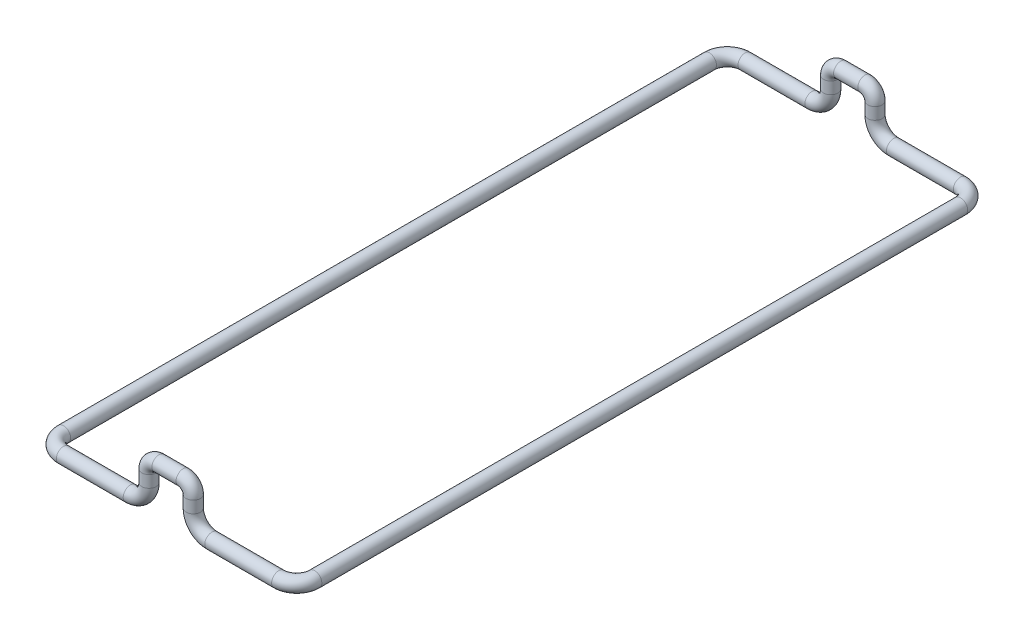
ISO-10303-21;
HEADER;
FILE_DESCRIPTION(('STEP AP214'),'2;1');
FILE_NAME('part.step','',(''),(''),'','','');
FILE_SCHEMA(('AUTOMOTIVE_DESIGN { 1 0 10303 214 1 1 1 1 }'));
ENDSEC;
DATA;
#1=APPLICATION_CONTEXT('core data for automotive mechanical design processes');
#2=APPLICATION_PROTOCOL_DEFINITION('international standard','automotive_design',2000,#1);
#3=PRODUCT_CONTEXT('',#1,'mechanical');
#4=PRODUCT('Part','Part','',(#3));
#5=PRODUCT_RELATED_PRODUCT_CATEGORY('part','',(#4));
#6=PRODUCT_DEFINITION_FORMATION('','',#4);
#7=PRODUCT_DEFINITION_CONTEXT('part definition',#1,'design');
#8=PRODUCT_DEFINITION('design','',#6,#7);
#9=PRODUCT_DEFINITION_SHAPE('','',#8);
#10=(LENGTH_UNIT() NAMED_UNIT(*) SI_UNIT(.MILLI.,.METRE.));
#11=(NAMED_UNIT(*) PLANE_ANGLE_UNIT() SI_UNIT($,.RADIAN.));
#12=(NAMED_UNIT(*) SI_UNIT($,.STERADIAN.) SOLID_ANGLE_UNIT());
#13=UNCERTAINTY_MEASURE_WITH_UNIT(LENGTH_MEASURE(1.E-05),#10,'distance_accuracy_value','');
#14=(GEOMETRIC_REPRESENTATION_CONTEXT(3) GLOBAL_UNCERTAINTY_ASSIGNED_CONTEXT((#13)) GLOBAL_UNIT_ASSIGNED_CONTEXT((#10,
#11,#12)) REPRESENTATION_CONTEXT('',''));
#15=CARTESIAN_POINT('',(0.,0.,0.));
#16=DIRECTION('',(0.,0.,1.));
#17=DIRECTION('',(1.,0.,0.));
#18=AXIS2_PLACEMENT_3D('',#15,#16,#17);
#19=CARTESIAN_POINT('',(7.66567035649461,-2.94835106418016,51.446892133563));
#20=DIRECTION('',(1.,0.,-4.26811217202508E-13));
#21=DIRECTION('',(-4.26811217202508E-13,0.,-1.));
#22=AXIS2_PLACEMENT_3D('',#19,#20,#21);
#23=CYLINDRICAL_SURFACE('',#22,0.999999999999998);
#24=CARTESIAN_POINT('',(16.9812320069101,-2.94835106418016,51.446892133559));
#25=DIRECTION('',(1.,0.,0.));
#26=DIRECTION('',(0.,0.,-1.));
#27=AXIS2_PLACEMENT_3D('',#24,#25,#26);
#28=CIRCLE('',#27,0.999999999999998);
#29=CARTESIAN_POINT('',(16.9812320069101,-2.94835106418016,52.4468921335559));
#30=VERTEX_POINT('',#29);
#31=EDGE_CURVE('E59',#30,#30,#28,.T.);
#32=ORIENTED_EDGE('',*,*,#31,.F.);
#33=EDGE_LOOP('',(#32));
#34=FACE_BOUND('',#33,.T.);
#35=CARTESIAN_POINT('',(7.66567035649461,-2.94835106418016,51.446892133563));
#36=DIRECTION('',(-1.,0.,0.));
#37=DIRECTION('',(0.,0.,1.));
#38=AXIS2_PLACEMENT_3D('',#35,#36,#37);
#39=CIRCLE('',#38,0.999999999999997);
#40=CARTESIAN_POINT('',(7.66567035649461,-3.94835106418016,51.446892133563));
#41=VERTEX_POINT('',#40);
#42=EDGE_CURVE('E83',#41,#41,#39,.T.);
#43=ORIENTED_EDGE('',*,*,#42,.F.);
#44=EDGE_LOOP('',(#43));
#45=FACE_BOUND('',#44,.T.);
#46=ADVANCED_FACE('F39',(#34,#45),#23,.T.);
#47=CARTESIAN_POINT('',(16.9812320069101,-2.94835106418016,48.946892133563));
#48=DIRECTION('',(0.,1.,0.));
#49=DIRECTION('',(0.,0.,1.));
#50=AXIS2_PLACEMENT_3D('',#47,#48,#49);
#51=TOROIDAL_SURFACE('',#50,2.49999999999286,0.999999999999998);
#52=CARTESIAN_POINT('',(19.4812320069061,-2.94835106418016,48.9468921335635));
#53=DIRECTION('',(4.27599753613536E-13,0.,-1.));
#54=DIRECTION('',(-1.,0.,-4.27599753613536E-13));
#55=AXIS2_PLACEMENT_3D('',#52,#53,#54);
#56=CIRCLE('',#55,0.999999999999998);
#57=CARTESIAN_POINT('',(20.4812320069029,-2.94835106418016,48.9468921335637));
#58=VERTEX_POINT('',#57);
#59=EDGE_CURVE('E54',#58,#58,#56,.T.);
#60=CARTESIAN_POINT('',(16.9812320069101,-2.94835106418016,48.946892133563));
#61=DIRECTION('',(0.,1.,0.));
#62=DIRECTION('',(0.,0.,1.));
#63=AXIS2_PLACEMENT_3D('',#60,#61,#62);
#64=CIRCLE('',#63,3.49999999999285);
#65=EDGE_CURVE('',#30,#58,#64,.T.);
#66=ORIENTED_EDGE('',*,*,#31,.T.);
#67=ORIENTED_EDGE('',*,*,#59,.F.);
#68=ORIENTED_EDGE('',*,*,#65,.T.);
#69=ORIENTED_EDGE('',*,*,#65,.F.);
#70=EDGE_LOOP('',(#66,#68,#67,#69));
#71=FACE_BOUND('',#70,.T.);
#72=ADVANCED_FACE('F166',(#71),#51,.T.);
#73=CARTESIAN_POINT('',(19.4812320069061,-2.94835106418016,48.9468921335635));
#74=DIRECTION('',(0.,0.,-1.));
#75=DIRECTION('',(-1.,0.,0.));
#76=AXIS2_PLACEMENT_3D('',#73,#74,#75);
#77=CYLINDRICAL_SURFACE('',#76,0.999999999999998);
#78=CARTESIAN_POINT('',(19.4812320069061,-2.94835106418016,-41.0531078664365));
#79=DIRECTION('',(4.27599753613536E-13,0.,-1.));
#80=DIRECTION('',(-1.,0.,-4.27599753613536E-13));
#81=AXIS2_PLACEMENT_3D('',#78,#79,#80);
#82=CIRCLE('',#81,0.999999999999998);
#83=CARTESIAN_POINT('',(20.4812320069061,-2.94835106418016,-41.0531078664363));
#84=VERTEX_POINT('',#83);
#85=EDGE_CURVE('E50',#84,#84,#82,.T.);
#86=ORIENTED_EDGE('',*,*,#85,.F.);
#87=EDGE_LOOP('',(#86));
#88=FACE_BOUND('',#87,.T.);
#89=ORIENTED_EDGE('',*,*,#59,.T.);
#90=EDGE_LOOP('',(#89));
#91=FACE_BOUND('',#90,.T.);
#92=ADVANCED_FACE('F161',(#88,#91),#77,.T.);
#93=CARTESIAN_POINT('',(16.9812320069101,-2.94835106418016,-41.053107866437));
#94=DIRECTION('',(0.,1.,0.));
#95=DIRECTION('',(0.,0.,1.));
#96=AXIS2_PLACEMENT_3D('',#93,#94,#95);
#97=TOROIDAL_SURFACE('',#96,2.49999999999602,0.999999999999998);
#98=CARTESIAN_POINT('',(16.9812320069106,-2.94835106418016,-43.553107866433));
#99=DIRECTION('',(-1.,0.,-4.30077930007789E-13));
#100=DIRECTION('',(-4.30077930007789E-13,0.,1.));
#101=AXIS2_PLACEMENT_3D('',#98,#99,#100);
#102=CIRCLE('',#101,0.999999999999998);
#103=CARTESIAN_POINT('',(16.9812320069107,-2.94835106418016,-44.553107866433));
#104=VERTEX_POINT('',#103);
#105=EDGE_CURVE('E46',#104,#104,#102,.T.);
#106=CARTESIAN_POINT('',(16.9812320069101,-2.94835106418016,-41.053107866437));
#107=DIRECTION('',(0.,1.,0.));
#108=DIRECTION('',(0.,0.,1.));
#109=AXIS2_PLACEMENT_3D('',#106,#107,#108);
#110=CIRCLE('',#109,3.49999999999602);
#111=EDGE_CURVE('',#84,#104,#110,.T.);
#112=ORIENTED_EDGE('',*,*,#85,.T.);
#113=ORIENTED_EDGE('',*,*,#105,.F.);
#114=ORIENTED_EDGE('',*,*,#111,.T.);
#115=ORIENTED_EDGE('',*,*,#111,.F.);
#116=EDGE_LOOP('',(#112,#114,#113,#115));
#117=FACE_BOUND('',#116,.T.);
#118=ADVANCED_FACE('F152',(#117),#97,.T.);
#119=CARTESIAN_POINT('',(16.9812320069106,-2.94835106418016,-43.553107866433));
#120=DIRECTION('',(-1.,0.,0.));
#121=DIRECTION('',(0.,0.,1.));
#122=AXIS2_PLACEMENT_3D('',#119,#120,#121);
#123=CYLINDRICAL_SURFACE('',#122,0.999999999999998);
#124=CARTESIAN_POINT('',(7.66567035649512,-2.94835106418016,-43.5531078664335));
#125=DIRECTION('',(-1.,0.,-4.78995868774048E-13));
#126=DIRECTION('',(-4.78995868774048E-13,0.,1.));
#127=AXIS2_PLACEMENT_3D('',#124,#125,#126);
#128=CIRCLE('',#127,0.999999999999998);
#129=CARTESIAN_POINT('',(7.66567035649532,-3.94835106418031,-43.5531078664335));
#130=VERTEX_POINT('',#129);
#131=EDGE_CURVE('E10',#130,#130,#128,.T.);
#132=ORIENTED_EDGE('',*,*,#131,.F.);
#133=EDGE_LOOP('',(#132));
#134=FACE_BOUND('',#133,.T.);
#135=ORIENTED_EDGE('',*,*,#105,.T.);
#136=EDGE_LOOP('',(#135));
#137=FACE_BOUND('',#136,.T.);
#138=ADVANCED_FACE('F41',(#134,#137),#123,.T.);
#139=CARTESIAN_POINT('',(7.66567035649459,-0.348351064180164,51.446892133563));
#140=DIRECTION('',(0.,0.,-1.));
#141=DIRECTION('',(-1.,0.,0.));
#142=AXIS2_PLACEMENT_3D('',#139,#140,#141);
#143=TOROIDAL_SURFACE('',#142,2.6,0.999999999999997);
#144=CARTESIAN_POINT('',(5.06567035649459,-0.348351064180184,51.446892133563));
#145=DIRECTION('',(0.,1.,0.));
#146=DIRECTION('',(0.,0.,1.));
#147=AXIS2_PLACEMENT_3D('',#144,#145,#146);
#148=CIRCLE('',#147,0.999999999999997);
#149=CARTESIAN_POINT('',(4.06567035649459,-0.348351064180192,51.446892133563));
#150=VERTEX_POINT('',#149);
#151=EDGE_CURVE('E80',#150,#150,#148,.T.);
#152=CARTESIAN_POINT('',(7.66567035649459,-0.348351064180164,51.446892133563));
#153=DIRECTION('',(0.,0.,-1.));
#154=DIRECTION('',(-1.,0.,0.));
#155=AXIS2_PLACEMENT_3D('',#152,#153,#154);
#156=CIRCLE('',#155,3.6);
#157=EDGE_CURVE('',#41,#150,#156,.T.);
#158=ORIENTED_EDGE('',*,*,#42,.T.);
#159=ORIENTED_EDGE('',*,*,#151,.F.);
#160=ORIENTED_EDGE('',*,*,#157,.T.);
#161=ORIENTED_EDGE('',*,*,#157,.F.);
#162=EDGE_LOOP('',(#158,#160,#159,#161));
#163=FACE_BOUND('',#162,.T.);
#164=ADVANCED_FACE('F151',(#163),#143,.T.);
#165=CARTESIAN_POINT('',(5.06567035649459,-0.348351064180185,51.446892133563));
#166=DIRECTION('',(0.,1.,0.));
#167=DIRECTION('',(-1.,0.,0.));
#168=AXIS2_PLACEMENT_3D('',#165,#166,#167);
#169=CYLINDRICAL_SURFACE('',#168,0.999999999999997);
#170=CARTESIAN_POINT('',(5.06567035649459,1.30239075529533,51.446892133563));
#171=DIRECTION('',(0.,1.,0.));
#172=DIRECTION('',(0.,0.,1.));
#173=AXIS2_PLACEMENT_3D('',#170,#171,#172);
#174=CIRCLE('',#173,0.999999999999997);
#175=CARTESIAN_POINT('',(6.06567035649458,1.30239075529531,51.446892133563));
#176=VERTEX_POINT('',#175);
#177=EDGE_CURVE('E77',#176,#176,#174,.T.);
#178=ORIENTED_EDGE('',*,*,#177,.F.);
#179=EDGE_LOOP('',(#178));
#180=FACE_BOUND('',#179,.T.);
#181=ORIENTED_EDGE('',*,*,#151,.T.);
#182=EDGE_LOOP('',(#181));
#183=FACE_BOUND('',#182,.T.);
#184=ADVANCED_FACE('F158',(#180,#183),#169,.T.);
#185=CARTESIAN_POINT('',(3.66567035649458,1.30239075529535,51.446892133563));
#186=DIRECTION('',(0.,0.,1.));
#187=DIRECTION('',(1.,0.,0.));
#188=AXIS2_PLACEMENT_3D('',#185,#186,#187);
#189=TOROIDAL_SURFACE('',#188,1.4,0.999999999999997);
#190=CARTESIAN_POINT('',(3.66567035649461,2.70239075529535,51.446892133563));
#191=DIRECTION('',(-1.,0.,0.));
#192=DIRECTION('',(0.,0.,1.));
#193=AXIS2_PLACEMENT_3D('',#190,#191,#192);
#194=CIRCLE('',#193,0.999999999999997);
#195=CARTESIAN_POINT('',(3.66567035649462,3.70239075529535,51.446892133563));
#196=VERTEX_POINT('',#195);
#197=EDGE_CURVE('E74',#196,#196,#194,.T.);
#198=CARTESIAN_POINT('',(3.66567035649458,1.30239075529535,51.446892133563));
#199=DIRECTION('',(0.,0.,1.));
#200=DIRECTION('',(1.,0.,0.));
#201=AXIS2_PLACEMENT_3D('',#198,#199,#200);
#202=CIRCLE('',#201,2.4);
#203=EDGE_CURVE('',#176,#196,#202,.T.);
#204=ORIENTED_EDGE('',*,*,#177,.T.);
#205=ORIENTED_EDGE('',*,*,#197,.F.);
#206=ORIENTED_EDGE('',*,*,#203,.T.);
#207=ORIENTED_EDGE('',*,*,#203,.F.);
#208=EDGE_LOOP('',(#204,#206,#205,#207));
#209=FACE_BOUND('',#208,.T.);
#210=ADVANCED_FACE('F187',(#209),#189,.T.);
#211=CARTESIAN_POINT('',(3.6656703564946,2.70239075529535,51.446892133563));
#212=DIRECTION('',(-1.,0.,0.));
#213=DIRECTION('',(0.,-1.,0.));
#214=AXIS2_PLACEMENT_3D('',#211,#212,#213);
#215=CYLINDRICAL_SURFACE('',#214,0.999999999999997);
#216=CARTESIAN_POINT('',(0.2967936573256,2.70239075529535,51.446892133563));
#217=DIRECTION('',(-1.,0.,0.));
#218=DIRECTION('',(0.,0.,1.));
#219=AXIS2_PLACEMENT_3D('',#216,#217,#218);
#220=CIRCLE('',#219,0.999999999999997);
#221=CARTESIAN_POINT('',(0.296793657325614,3.70239075529535,51.446892133563));
#222=VERTEX_POINT('',#221);
#223=EDGE_CURVE('E71',#222,#222,#220,.T.);
#224=ORIENTED_EDGE('',*,*,#223,.F.);
#225=EDGE_LOOP('',(#224));
#226=FACE_BOUND('',#225,.T.);
#227=ORIENTED_EDGE('',*,*,#197,.T.);
#228=EDGE_LOOP('',(#227));
#229=FACE_BOUND('',#228,.T.);
#230=ADVANCED_FACE('F183',(#226,#229),#215,.T.);
#231=CARTESIAN_POINT('',(0.296793657325581,1.30239075529535,51.446892133563));
#232=DIRECTION('',(0.,0.,1.));
#233=DIRECTION('',(1.,0.,0.));
#234=AXIS2_PLACEMENT_3D('',#231,#232,#233);
#235=TOROIDAL_SURFACE('',#234,1.4,0.999999999999997);
#236=CARTESIAN_POINT('',(-1.10320634267442,1.30239075529537,51.446892133563));
#237=DIRECTION('',(0.,-1.,0.));
#238=DIRECTION('',(0.,0.,1.));
#239=AXIS2_PLACEMENT_3D('',#236,#237,#238);
#240=CIRCLE('',#239,0.999999999999997);
#241=CARTESIAN_POINT('',(-2.10320634267442,1.30239075529538,51.446892133563));
#242=VERTEX_POINT('',#241);
#243=EDGE_CURVE('E68',#242,#242,#240,.T.);
#244=CARTESIAN_POINT('',(0.296793657325581,1.30239075529535,51.446892133563));
#245=DIRECTION('',(0.,0.,1.));
#246=DIRECTION('',(1.,0.,0.));
#247=AXIS2_PLACEMENT_3D('',#244,#245,#246);
#248=CIRCLE('',#247,2.4);
#249=EDGE_CURVE('',#222,#242,#248,.T.);
#250=ORIENTED_EDGE('',*,*,#223,.T.);
#251=ORIENTED_EDGE('',*,*,#243,.F.);
#252=ORIENTED_EDGE('',*,*,#249,.T.);
#253=ORIENTED_EDGE('',*,*,#249,.F.);
#254=EDGE_LOOP('',(#250,#252,#251,#253));
#255=FACE_BOUND('',#254,.T.);
#256=ADVANCED_FACE('F179',(#255),#235,.T.);
#257=CARTESIAN_POINT('',(-1.10320634267442,1.30239075529537,51.446892133563));
#258=DIRECTION('',(0.,-1.,0.));
#259=DIRECTION('',(1.,0.,0.));
#260=AXIS2_PLACEMENT_3D('',#257,#258,#259);
#261=CYLINDRICAL_SURFACE('',#260,0.999999999999997);
#262=CARTESIAN_POINT('',(-1.10320634267442,-0.348351064180145,51.446892133563));
#263=DIRECTION('',(0.,-1.,0.));
#264=DIRECTION('',(0.,0.,1.));
#265=AXIS2_PLACEMENT_3D('',#262,#263,#264);
#266=CIRCLE('',#265,0.999999999999997);
#267=CARTESIAN_POINT('',(-0.103206342674426,-0.348351064180138,51.446892133563));
#268=VERTEX_POINT('',#267);
#269=EDGE_CURVE('E65',#268,#268,#266,.T.);
#270=ORIENTED_EDGE('',*,*,#269,.F.);
#271=EDGE_LOOP('',(#270));
#272=FACE_BOUND('',#271,.T.);
#273=ORIENTED_EDGE('',*,*,#243,.T.);
#274=EDGE_LOOP('',(#273));
#275=FACE_BOUND('',#274,.T.);
#276=ADVANCED_FACE('F143',(#272,#275),#261,.T.);
#277=CARTESIAN_POINT('',(-3.70320634267442,-0.348351064180164,51.446892133563));
#278=DIRECTION('',(0.,0.,-1.));
#279=DIRECTION('',(-1.,0.,0.));
#280=AXIS2_PLACEMENT_3D('',#277,#278,#279);
#281=TOROIDAL_SURFACE('',#280,2.6,0.999999999999997);
#282=CARTESIAN_POINT('',(-3.7032063426744,-2.94835106418016,51.446892133563));
#283=DIRECTION('',(-1.,0.,0.));
#284=DIRECTION('',(0.,0.,1.));
#285=AXIS2_PLACEMENT_3D('',#282,#283,#284);
#286=CIRCLE('',#285,0.999999999999997);
#287=CARTESIAN_POINT('',(-3.70320634267439,-3.94835106418016,51.446892133563));
#288=VERTEX_POINT('',#287);
#289=EDGE_CURVE('E62',#288,#288,#286,.T.);
#290=CARTESIAN_POINT('',(-3.70320634267442,-0.348351064180164,51.446892133563));
#291=DIRECTION('',(0.,0.,-1.));
#292=DIRECTION('',(-1.,0.,0.));
#293=AXIS2_PLACEMENT_3D('',#290,#291,#292);
#294=CIRCLE('',#293,3.59999999999999);
#295=EDGE_CURVE('',#268,#288,#294,.T.);
#296=ORIENTED_EDGE('',*,*,#269,.T.);
#297=ORIENTED_EDGE('',*,*,#289,.F.);
#298=ORIENTED_EDGE('',*,*,#295,.T.);
#299=ORIENTED_EDGE('',*,*,#295,.F.);
#300=EDGE_LOOP('',(#296,#298,#297,#299));
#301=FACE_BOUND('',#300,.T.);
#302=ADVANCED_FACE('F132',(#301),#281,.T.);
#303=CARTESIAN_POINT('',(-3.70320634267442,-0.348351064180164,-43.5531078664335));
#304=DIRECTION('',(0.,0.,1.));
#305=DIRECTION('',(1.,0.,0.));
#306=AXIS2_PLACEMENT_3D('',#303,#304,#305);
#307=TOROIDAL_SURFACE('',#306,2.6,1.00000000000015);
#308=CARTESIAN_POINT('',(-3.70320634267419,-2.94835106418016,-43.5531078664335));
#309=DIRECTION('',(-1.,0.,-4.72052983947694E-13));
#310=DIRECTION('',(-4.72052983947694E-13,0.,1.));
#311=AXIS2_PLACEMENT_3D('',#308,#309,#310);
#312=CIRCLE('',#311,1.00000000000015);
#313=CARTESIAN_POINT('',(-3.7032063426741,-3.94835106418031,-43.5531078664335));
#314=VERTEX_POINT('',#313);
#315=EDGE_CURVE('E104',#314,#314,#312,.T.);
#316=CARTESIAN_POINT('',(-1.10320634267442,-0.348351064179937,-43.5531078664335));
#317=DIRECTION('',(0.,-1.,-4.72052983947694E-13));
#318=DIRECTION('',(0.,-4.72052983947694E-13,1.));
#319=AXIS2_PLACEMENT_3D('',#316,#317,#318);
#320=CIRCLE('',#319,1.00000000000015);
#321=CARTESIAN_POINT('',(-0.103206342674275,-0.348351064179849,-43.5531078664335));
#322=VERTEX_POINT('',#321);
#323=EDGE_CURVE('E101',#322,#322,#320,.T.);
#324=CARTESIAN_POINT('',(-3.70320634267442,-0.348351064180164,-43.5531078664335));
#325=DIRECTION('',(0.,0.,1.));
#326=DIRECTION('',(1.,0.,0.));
#327=AXIS2_PLACEMENT_3D('',#324,#325,#326);
#328=CIRCLE('',#327,3.60000000000015);
#329=EDGE_CURVE('',#314,#322,#328,.T.);
#330=ORIENTED_EDGE('',*,*,#315,.F.);
#331=ORIENTED_EDGE('',*,*,#323,.T.);
#332=ORIENTED_EDGE('',*,*,#329,.T.);
#333=ORIENTED_EDGE('',*,*,#329,.F.);
#334=EDGE_LOOP('',(#330,#332,#331,#333));
#335=FACE_BOUND('',#334,.T.);
#336=ADVANCED_FACE('F129',(#335),#307,.T.);
#337=CARTESIAN_POINT('',(-1.10320634267442,-0.348351064179936,-43.5531078664335));
#338=DIRECTION('',(0.,1.,0.));
#339=DIRECTION('',(-1.,0.,0.));
#340=AXIS2_PLACEMENT_3D('',#337,#338,#339);
#341=CYLINDRICAL_SURFACE('',#340,1.00000000000015);
#342=CARTESIAN_POINT('',(-1.10320634267442,1.30239075529558,-43.5531078664335));
#343=DIRECTION('',(0.,-1.,-4.72052983947694E-13));
#344=DIRECTION('',(0.,-4.72052983947694E-13,1.));
#345=AXIS2_PLACEMENT_3D('',#342,#343,#344);
#346=CIRCLE('',#345,1.00000000000015);
#347=CARTESIAN_POINT('',(-2.10320634267457,1.30239075529574,-43.5531078664335));
#348=VERTEX_POINT('',#347);
#349=EDGE_CURVE('E98',#348,#348,#346,.T.);
#350=ORIENTED_EDGE('',*,*,#349,.T.);
#351=EDGE_LOOP('',(#350));
#352=FACE_BOUND('',#351,.T.);
#353=ORIENTED_EDGE('',*,*,#323,.F.);
#354=EDGE_LOOP('',(#353));
#355=FACE_BOUND('',#354,.T.);
#356=ADVANCED_FACE('F131',(#352,#355),#341,.T.);
#357=CARTESIAN_POINT('',(0.296793657325581,1.30239075529535,-43.5531078664335));
#358=DIRECTION('',(0.,0.,-1.));
#359=DIRECTION('',(-1.,0.,0.));
#360=AXIS2_PLACEMENT_3D('',#357,#358,#359);
#361=TOROIDAL_SURFACE('',#360,1.4,1.00000000000015);
#362=CARTESIAN_POINT('',(0.296793657325807,2.70239075529535,-43.5531078664335));
#363=DIRECTION('',(-1.,0.,-4.72052983947694E-13));
#364=DIRECTION('',(-4.72052983947694E-13,0.,1.));
#365=AXIS2_PLACEMENT_3D('',#362,#363,#364);
#366=CIRCLE('',#365,1.00000000000015);
#367=CARTESIAN_POINT('',(0.296793657325968,3.7023907552955,-43.5531078664335));
#368=VERTEX_POINT('',#367);
#369=EDGE_CURVE('E95',#368,#368,#366,.T.);
#370=CARTESIAN_POINT('',(0.296793657325581,1.30239075529535,-43.5531078664335));
#371=DIRECTION('',(0.,0.,-1.));
#372=DIRECTION('',(-1.,0.,0.));
#373=AXIS2_PLACEMENT_3D('',#370,#371,#372);
#374=CIRCLE('',#373,2.40000000000015);
#375=EDGE_CURVE('',#348,#368,#374,.T.);
#376=ORIENTED_EDGE('',*,*,#349,.F.);
#377=ORIENTED_EDGE('',*,*,#369,.T.);
#378=ORIENTED_EDGE('',*,*,#375,.T.);
#379=ORIENTED_EDGE('',*,*,#375,.F.);
#380=EDGE_LOOP('',(#376,#378,#377,#379));
#381=FACE_BOUND('',#380,.T.);
#382=ADVANCED_FACE('F140',(#381),#361,.T.);
#383=CARTESIAN_POINT('',(0.296793657325809,2.70239075529535,-43.5531078664335));
#384=DIRECTION('',(1.,0.,0.));
#385=DIRECTION('',(0.,1.,0.));
#386=AXIS2_PLACEMENT_3D('',#383,#384,#385);
#387=CYLINDRICAL_SURFACE('',#386,1.00000000000015);
#388=CARTESIAN_POINT('',(3.66567035649481,2.70239075529535,-43.5531078664335));
#389=DIRECTION('',(-1.,0.,-4.72052983947694E-13));
#390=DIRECTION('',(-4.72052983947694E-13,0.,1.));
#391=AXIS2_PLACEMENT_3D('',#388,#389,#390);
#392=CIRCLE('',#391,1.00000000000015);
#393=CARTESIAN_POINT('',(3.66567035649498,3.7023907552955,-43.5531078664335));
#394=VERTEX_POINT('',#393);
#395=EDGE_CURVE('E92',#394,#394,#392,.T.);
#396=ORIENTED_EDGE('',*,*,#395,.T.);
#397=EDGE_LOOP('',(#396));
#398=FACE_BOUND('',#397,.T.);
#399=ORIENTED_EDGE('',*,*,#369,.F.);
#400=EDGE_LOOP('',(#399));
#401=FACE_BOUND('',#400,.T.);
#402=ADVANCED_FACE('F204',(#398,#401),#387,.T.);
#403=CARTESIAN_POINT('',(3.66567035649458,1.30239075529535,-43.5531078664335));
#404=DIRECTION('',(0.,0.,-1.));
#405=DIRECTION('',(-1.,0.,0.));
#406=AXIS2_PLACEMENT_3D('',#403,#404,#405);
#407=TOROIDAL_SURFACE('',#406,1.4,1.00000000000015);
#408=CARTESIAN_POINT('',(5.06567035649458,1.30239075529512,-43.5531078664335));
#409=DIRECTION('',(0.,1.,-4.72052983947694E-13));
#410=DIRECTION('',(0.,4.72052983947694E-13,1.));
#411=AXIS2_PLACEMENT_3D('',#408,#409,#410);
#412=CIRCLE('',#411,1.00000000000015);
#413=CARTESIAN_POINT('',(6.06567035649473,1.30239075529496,-43.5531078664335));
#414=VERTEX_POINT('',#413);
#415=EDGE_CURVE('E89',#414,#414,#412,.T.);
#416=CARTESIAN_POINT('',(3.66567035649458,1.30239075529535,-43.5531078664335));
#417=DIRECTION('',(0.,0.,-1.));
#418=DIRECTION('',(-1.,0.,0.));
#419=AXIS2_PLACEMENT_3D('',#416,#417,#418);
#420=CIRCLE('',#419,2.40000000000015);
#421=EDGE_CURVE('',#394,#414,#420,.T.);
#422=ORIENTED_EDGE('',*,*,#395,.F.);
#423=ORIENTED_EDGE('',*,*,#415,.T.);
#424=ORIENTED_EDGE('',*,*,#421,.T.);
#425=ORIENTED_EDGE('',*,*,#421,.F.);
#426=EDGE_LOOP('',(#422,#424,#423,#425));
#427=FACE_BOUND('',#426,.T.);
#428=ADVANCED_FACE('F200',(#427),#407,.T.);
#429=CARTESIAN_POINT('',(5.06567035649458,1.30239075529512,-43.5531078664335));
#430=DIRECTION('',(0.,-1.,0.));
#431=DIRECTION('',(1.,0.,0.));
#432=AXIS2_PLACEMENT_3D('',#429,#430,#431);
#433=CYLINDRICAL_SURFACE('',#432,1.00000000000015);
#434=CARTESIAN_POINT('',(5.06567035649459,-0.348351064180392,-43.5531078664335));
#435=DIRECTION('',(0.,1.,-4.72052983947694E-13));
#436=DIRECTION('',(0.,4.72052983947694E-13,1.));
#437=AXIS2_PLACEMENT_3D('',#434,#435,#436);
#438=CIRCLE('',#437,1.00000000000015);
#439=CARTESIAN_POINT('',(4.06567035649444,-0.34835106418048,-43.5531078664335));
#440=VERTEX_POINT('',#439);
#441=EDGE_CURVE('E86',#440,#440,#438,.T.);
#442=ORIENTED_EDGE('',*,*,#441,.T.);
#443=EDGE_LOOP('',(#442));
#444=FACE_BOUND('',#443,.T.);
#445=ORIENTED_EDGE('',*,*,#415,.F.);
#446=EDGE_LOOP('',(#445));
#447=FACE_BOUND('',#446,.T.);
#448=ADVANCED_FACE('F197',(#444,#447),#433,.T.);
#449=CARTESIAN_POINT('',(7.66567035649459,-0.348351064180164,-43.5531078664335));
#450=DIRECTION('',(0.,0.,1.));
#451=DIRECTION('',(1.,0.,0.));
#452=AXIS2_PLACEMENT_3D('',#449,#450,#451);
#453=TOROIDAL_SURFACE('',#452,2.6,1.00000000000015);
#454=CARTESIAN_POINT('',(7.66567035649459,-0.348351064180164,-43.5531078664335));
#455=DIRECTION('',(0.,0.,1.));
#456=DIRECTION('',(1.,0.,0.));
#457=AXIS2_PLACEMENT_3D('',#454,#455,#456);
#458=CIRCLE('',#457,3.60000000000015);
#459=EDGE_CURVE('',#440,#130,#458,.T.);
#460=ORIENTED_EDGE('',*,*,#441,.F.);
#461=ORIENTED_EDGE('',*,*,#131,.T.);
#462=ORIENTED_EDGE('',*,*,#459,.T.);
#463=ORIENTED_EDGE('',*,*,#459,.F.);
#464=EDGE_LOOP('',(#460,#462,#461,#463));
#465=FACE_BOUND('',#464,.T.);
#466=ADVANCED_FACE('F125',(#465),#453,.T.);
#467=CARTESIAN_POINT('',(-3.70320634267419,-2.94835106418016,-43.5531078664335));
#468=DIRECTION('',(-1.,0.,0.));
#469=DIRECTION('',(0.,0.,1.));
#470=AXIS2_PLACEMENT_3D('',#467,#468,#469);
#471=CYLINDRICAL_SURFACE('',#470,1.00000000000012);
#472=CARTESIAN_POINT('',(-13.0187679930897,-2.94835106418016,-43.5531078664335));
#473=DIRECTION('',(-1.,0.,-4.72052983947694E-13));
#474=DIRECTION('',(-4.72052983947694E-13,0.,1.));
#475=AXIS2_PLACEMENT_3D('',#472,#473,#474);
#476=CIRCLE('',#475,1.00000000000012);
#477=CARTESIAN_POINT('',(-13.0187679930896,-2.94835106418016,-44.5531078664336));
#478=VERTEX_POINT('',#477);
#479=EDGE_CURVE('E116',#478,#478,#476,.T.);
#480=ORIENTED_EDGE('',*,*,#479,.F.);
#481=EDGE_LOOP('',(#480));
#482=FACE_BOUND('',#481,.T.);
#483=ORIENTED_EDGE('',*,*,#315,.T.);
#484=EDGE_LOOP('',(#483));
#485=FACE_BOUND('',#484,.T.);
#486=ADVANCED_FACE('F122',(#482,#485),#471,.T.);
#487=CARTESIAN_POINT('',(-13.0187679930899,-2.94835106418016,-41.053107866437));
#488=DIRECTION('',(0.,1.,0.));
#489=DIRECTION('',(0.,0.,1.));
#490=AXIS2_PLACEMENT_3D('',#487,#488,#489);
#491=TOROIDAL_SURFACE('',#490,2.4999999999965,1.00000000000012);
#492=CARTESIAN_POINT('',(-15.5187679930864,-2.94835106418016,-41.0531078664372));
#493=DIRECTION('',(-4.72052983947694E-13,0.,1.));
#494=DIRECTION('',(1.,0.,4.72052983947694E-13));
#495=AXIS2_PLACEMENT_3D('',#492,#493,#494);
#496=CIRCLE('',#495,1.00000000000012);
#497=CARTESIAN_POINT('',(-16.5187679930865,-2.94835106418016,-41.0531078664373));
#498=VERTEX_POINT('',#497);
#499=EDGE_CURVE('E113',#498,#498,#496,.T.);
#500=CARTESIAN_POINT('',(-13.0187679930899,-2.94835106418016,-41.053107866437));
#501=DIRECTION('',(0.,1.,0.));
#502=DIRECTION('',(0.,0.,1.));
#503=AXIS2_PLACEMENT_3D('',#500,#501,#502);
#504=CIRCLE('',#503,3.49999999999662);
#505=EDGE_CURVE('',#478,#498,#504,.T.);
#506=ORIENTED_EDGE('',*,*,#479,.T.);
#507=ORIENTED_EDGE('',*,*,#499,.F.);
#508=ORIENTED_EDGE('',*,*,#505,.T.);
#509=ORIENTED_EDGE('',*,*,#505,.F.);
#510=EDGE_LOOP('',(#506,#508,#507,#509));
#511=FACE_BOUND('',#510,.T.);
#512=ADVANCED_FACE('F120',(#511),#491,.T.);
#513=CARTESIAN_POINT('',(-15.5187679930864,-2.94835106418016,-41.0531078664372));
#514=DIRECTION('',(0.,0.,1.));
#515=DIRECTION('',(1.,0.,0.));
#516=AXIS2_PLACEMENT_3D('',#513,#514,#515);
#517=CYLINDRICAL_SURFACE('',#516,1.00000000000012);
#518=CARTESIAN_POINT('',(-15.5187679930864,-2.94835106418016,48.9468921335627));
#519=DIRECTION('',(-4.72052983947694E-13,0.,1.));
#520=DIRECTION('',(1.,0.,4.72052983947694E-13));
#521=AXIS2_PLACEMENT_3D('',#518,#519,#520);
#522=CIRCLE('',#521,1.00000000000012);
#523=CARTESIAN_POINT('',(-16.5187679930865,-2.94835106418016,48.9468921335626));
#524=VERTEX_POINT('',#523);
#525=EDGE_CURVE('E110',#524,#524,#522,.T.);
#526=ORIENTED_EDGE('',*,*,#525,.F.);
#527=EDGE_LOOP('',(#526));
#528=FACE_BOUND('',#527,.T.);
#529=ORIENTED_EDGE('',*,*,#499,.T.);
#530=EDGE_LOOP('',(#529));
#531=FACE_BOUND('',#530,.T.);
#532=ADVANCED_FACE('F247',(#528,#531),#517,.T.);
#533=CARTESIAN_POINT('',(-13.0187679930899,-2.94835106418016,48.946892133563));
#534=DIRECTION('',(0.,1.,0.));
#535=DIRECTION('',(0.,0.,1.));
#536=AXIS2_PLACEMENT_3D('',#533,#534,#535);
#537=TOROIDAL_SURFACE('',#536,2.49999999999649,1.00000000000012);
#538=CARTESIAN_POINT('',(-13.0187679930901,-2.94835106418016,51.4468921335595));
#539=DIRECTION('',(1.,0.,4.72052983947694E-13));
#540=DIRECTION('',(4.72052983947694E-13,0.,-1.));
#541=AXIS2_PLACEMENT_3D('',#538,#539,#540);
#542=CIRCLE('',#541,1.00000000000012);
#543=CARTESIAN_POINT('',(-13.0187679930902,-2.94835106418016,52.4468921335596));
#544=VERTEX_POINT('',#543);
#545=EDGE_CURVE('E107',#544,#544,#542,.T.);
#546=CARTESIAN_POINT('',(-13.0187679930899,-2.94835106418016,48.946892133563));
#547=DIRECTION('',(0.,1.,0.));
#548=DIRECTION('',(0.,0.,1.));
#549=AXIS2_PLACEMENT_3D('',#546,#547,#548);
#550=CIRCLE('',#549,3.49999999999661);
#551=EDGE_CURVE('',#524,#544,#550,.T.);
#552=ORIENTED_EDGE('',*,*,#525,.T.);
#553=ORIENTED_EDGE('',*,*,#545,.F.);
#554=ORIENTED_EDGE('',*,*,#551,.T.);
#555=ORIENTED_EDGE('',*,*,#551,.F.);
#556=EDGE_LOOP('',(#552,#554,#553,#555));
#557=FACE_BOUND('',#556,.T.);
#558=ADVANCED_FACE('F148',(#557),#537,.T.);
#559=CARTESIAN_POINT('',(-13.0187679930906,-2.94835106418016,51.4468921335595));
#560=DIRECTION('',(1.,0.,4.32025327344283E-13));
#561=DIRECTION('',(4.32025327344283E-13,0.,-1.));
#562=AXIS2_PLACEMENT_3D('',#559,#560,#561);
#563=CYLINDRICAL_SURFACE('',#562,1.00000000000012);
#564=ORIENTED_EDGE('',*,*,#289,.T.);
#565=EDGE_LOOP('',(#564));
#566=FACE_BOUND('',#565,.T.);
#567=ORIENTED_EDGE('',*,*,#545,.T.);
#568=EDGE_LOOP('',(#567));
#569=FACE_BOUND('',#568,.T.);
#570=ADVANCED_FACE('F135',(#566,#569),#563,.T.);
#571=CLOSED_SHELL('',(#46,#72,#92,#118,#138,#164,#184,#210,#230,#256,#276,#302,#336,#356,#382,
#402,#428,#448,#466,#486,#512,#532,#558,#570));
#572=MANIFOLD_SOLID_BREP('B2',#571);
#573=ADVANCED_BREP_SHAPE_REPRESENTATION('',(#18,#572),#14);
#574=SHAPE_DEFINITION_REPRESENTATION(#9,#573);
ENDSEC;
END-ISO-10303-21;
